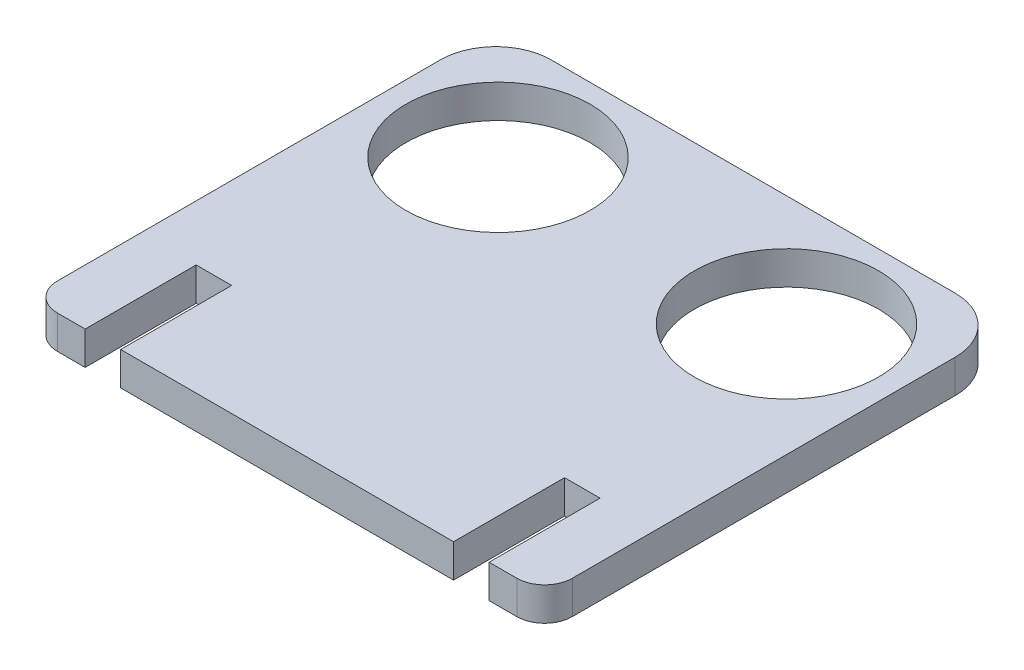
ISO-10303-21;
HEADER;
FILE_DESCRIPTION(('STEP AP214'),'2;1');
FILE_NAME('part.step','',(''),(''),'','','');
FILE_SCHEMA(('AUTOMOTIVE_DESIGN { 1 0 10303 214 1 1 1 1 }'));
ENDSEC;
DATA;
#1=APPLICATION_CONTEXT('core data for automotive mechanical design processes');
#2=APPLICATION_PROTOCOL_DEFINITION('international standard','automotive_design',2000,#1);
#3=PRODUCT_CONTEXT('',#1,'mechanical');
#4=PRODUCT('Part','Part','',(#3));
#5=PRODUCT_RELATED_PRODUCT_CATEGORY('part','',(#4));
#6=PRODUCT_DEFINITION_FORMATION('','',#4);
#7=PRODUCT_DEFINITION_CONTEXT('part definition',#1,'design');
#8=PRODUCT_DEFINITION('design','',#6,#7);
#9=PRODUCT_DEFINITION_SHAPE('','',#8);
#10=(LENGTH_UNIT() NAMED_UNIT(*) SI_UNIT(.MILLI.,.METRE.));
#11=(NAMED_UNIT(*) PLANE_ANGLE_UNIT() SI_UNIT($,.RADIAN.));
#12=(NAMED_UNIT(*) SI_UNIT($,.STERADIAN.) SOLID_ANGLE_UNIT());
#13=UNCERTAINTY_MEASURE_WITH_UNIT(LENGTH_MEASURE(1.E-05),#10,'distance_accuracy_value','');
#14=(GEOMETRIC_REPRESENTATION_CONTEXT(3) GLOBAL_UNCERTAINTY_ASSIGNED_CONTEXT((#13)) GLOBAL_UNIT_ASSIGNED_CONTEXT((#10,
#11,#12)) REPRESENTATION_CONTEXT('',''));
#15=CARTESIAN_POINT('',(0.,0.,0.));
#16=DIRECTION('',(0.,0.,1.));
#17=DIRECTION('',(1.,0.,0.));
#18=AXIS2_PLACEMENT_3D('',#15,#16,#17);
#19=CARTESIAN_POINT('',(-20.7,3.,7.5));
#20=DIRECTION('',(0.,1.,0.));
#21=DIRECTION('',(0.,0.,1.));
#22=AXIS2_PLACEMENT_3D('',#19,#20,#21);
#23=PLANE('',#22);
#24=CARTESIAN_POINT('',(13.,3.,-22.));
#25=DIRECTION('',(0.,1.,0.));
#26=DIRECTION('',(0.,0.,1.));
#27=AXIS2_PLACEMENT_3D('',#24,#25,#26);
#28=CIRCLE('',#27,8.3);
#29=CARTESIAN_POINT('',(13.,3.,-13.7));
#30=VERTEX_POINT('',#29);
#31=EDGE_CURVE('E194',#30,#30,#28,.T.);
#32=ORIENTED_EDGE('',*,*,#31,.F.);
#33=EDGE_LOOP('',(#32));
#34=FACE_BOUND('',#33,.T.);
#35=DIRECTION('',(0.,0.,-1.));
#36=VECTOR('',#35,1.);
#37=CARTESIAN_POINT('',(15.,3.,0.));
#38=LINE('',#37,#36);
#39=CARTESIAN_POINT('',(15.,3.,10.));
#40=VERTEX_POINT('',#39);
#41=CARTESIAN_POINT('',(15.,3.,0.));
#42=VERTEX_POINT('',#41);
#43=EDGE_CURVE('E238',#40,#42,#38,.T.);
#44=ORIENTED_EDGE('',*,*,#43,.T.);
#45=DIRECTION('',(1.,0.,0.));
#46=VECTOR('',#45,1.);
#47=CARTESIAN_POINT('',(18.2,3.,0.));
#48=LINE('',#47,#46);
#49=CARTESIAN_POINT('',(18.2,3.,0.));
#50=VERTEX_POINT('',#49);
#51=EDGE_CURVE('E124',#42,#50,#48,.T.);
#52=ORIENTED_EDGE('',*,*,#51,.T.);
#53=DIRECTION('',(0.,0.,1.));
#54=VECTOR('',#53,1.);
#55=CARTESIAN_POINT('',(18.2,3.,10.));
#56=LINE('',#55,#54);
#57=CARTESIAN_POINT('',(18.2,3.,10.));
#58=VERTEX_POINT('',#57);
#59=EDGE_CURVE('E291',#50,#58,#56,.T.);
#60=ORIENTED_EDGE('',*,*,#59,.T.);
#61=DIRECTION('',(1.,0.,0.));
#62=VECTOR('',#61,1.);
#63=CARTESIAN_POINT('',(20.7,3.,10.));
#64=LINE('',#63,#62);
#65=CARTESIAN_POINT('',(20.7,3.,10.));
#66=VERTEX_POINT('',#65);
#67=EDGE_CURVE('E310',#58,#66,#64,.T.);
#68=ORIENTED_EDGE('',*,*,#67,.T.);
#69=CARTESIAN_POINT('',(20.7,3.,7.5));
#70=DIRECTION('',(0.,1.,0.));
#71=DIRECTION('',(0.,0.,-1.));
#72=AXIS2_PLACEMENT_3D('',#69,#70,#71);
#73=CIRCLE('',#72,2.5);
#74=CARTESIAN_POINT('',(23.2,3.,7.5));
#75=VERTEX_POINT('',#74);
#76=EDGE_CURVE('E306',#66,#75,#73,.T.);
#77=ORIENTED_EDGE('',*,*,#76,.T.);
#78=DIRECTION('',(0.,0.,-1.));
#79=VECTOR('',#78,1.);
#80=CARTESIAN_POINT('',(23.2,3.,-12.));
#81=LINE('',#80,#79);
#82=CARTESIAN_POINT('',(23.2,3.,-27.));
#83=VERTEX_POINT('',#82);
#84=EDGE_CURVE('E309',#75,#83,#81,.T.);
#85=ORIENTED_EDGE('',*,*,#84,.T.);
#86=CARTESIAN_POINT('',(18.2,3.,-27.));
#87=DIRECTION('',(0.,1.,0.));
#88=DIRECTION('',(0.,0.,1.));
#89=AXIS2_PLACEMENT_3D('',#86,#87,#88);
#90=CIRCLE('',#89,5.);
#91=CARTESIAN_POINT('',(18.2,3.,-32.));
#92=VERTEX_POINT('',#91);
#93=EDGE_CURVE('E314',#83,#92,#90,.T.);
#94=ORIENTED_EDGE('',*,*,#93,.T.);
#95=DIRECTION('',(-1.,0.,0.));
#96=VECTOR('',#95,1.);
#97=CARTESIAN_POINT('',(18.2,3.,-32.));
#98=LINE('',#97,#96);
#99=CARTESIAN_POINT('',(-18.2,3.,-32.));
#100=VERTEX_POINT('',#99);
#101=EDGE_CURVE('E321',#92,#100,#98,.T.);
#102=ORIENTED_EDGE('',*,*,#101,.T.);
#103=CARTESIAN_POINT('',(-18.2,3.,-27.));
#104=DIRECTION('',(0.,1.,0.));
#105=DIRECTION('',(0.,0.,-1.));
#106=AXIS2_PLACEMENT_3D('',#103,#104,#105);
#107=CIRCLE('',#106,5.);
#108=CARTESIAN_POINT('',(-23.2,3.,-27.));
#109=VERTEX_POINT('',#108);
#110=EDGE_CURVE('E324',#100,#109,#107,.T.);
#111=ORIENTED_EDGE('',*,*,#110,.T.);
#112=DIRECTION('',(0.,0.,1.));
#113=VECTOR('',#112,1.);
#114=CARTESIAN_POINT('',(-23.2,3.,-27.));
#115=LINE('',#114,#113);
#116=CARTESIAN_POINT('',(-23.2,3.,7.5));
#117=VERTEX_POINT('',#116);
#118=EDGE_CURVE('E327',#109,#117,#115,.T.);
#119=ORIENTED_EDGE('',*,*,#118,.T.);
#120=CARTESIAN_POINT('',(-20.7,3.,7.5));
#121=DIRECTION('',(0.,1.,0.));
#122=DIRECTION('',(0.,0.,1.));
#123=AXIS2_PLACEMENT_3D('',#120,#121,#122);
#124=CIRCLE('',#123,2.5);
#125=CARTESIAN_POINT('',(-20.7,3.,10.));
#126=VERTEX_POINT('',#125);
#127=EDGE_CURVE('E330',#117,#126,#124,.T.);
#128=ORIENTED_EDGE('',*,*,#127,.T.);
#129=DIRECTION('',(1.,0.,0.));
#130=VECTOR('',#129,1.);
#131=CARTESIAN_POINT('',(-20.7,3.,10.));
#132=LINE('',#131,#130);
#133=CARTESIAN_POINT('',(-18.2,3.,10.));
#134=VERTEX_POINT('',#133);
#135=EDGE_CURVE('E333',#126,#134,#132,.T.);
#136=ORIENTED_EDGE('',*,*,#135,.T.);
#137=DIRECTION('',(0.,0.,-1.));
#138=VECTOR('',#137,1.);
#139=CARTESIAN_POINT('',(-18.2,3.,10.));
#140=LINE('',#139,#138);
#141=CARTESIAN_POINT('',(-18.2,3.,0.));
#142=VERTEX_POINT('',#141);
#143=EDGE_CURVE('E167',#134,#142,#140,.T.);
#144=ORIENTED_EDGE('',*,*,#143,.T.);
#145=DIRECTION('',(1.,0.,0.));
#146=VECTOR('',#145,1.);
#147=CARTESIAN_POINT('',(-18.2,3.,0.));
#148=LINE('',#147,#146);
#149=CARTESIAN_POINT('',(-15.,3.,0.));
#150=VERTEX_POINT('',#149);
#151=EDGE_CURVE('E161',#142,#150,#148,.T.);
#152=ORIENTED_EDGE('',*,*,#151,.T.);
#153=DIRECTION('',(0.,0.,1.));
#154=VECTOR('',#153,1.);
#155=CARTESIAN_POINT('',(-15.,3.,0.));
#156=LINE('',#155,#154);
#157=CARTESIAN_POINT('',(-15.,3.,10.));
#158=VERTEX_POINT('',#157);
#159=EDGE_CURVE('E165',#150,#158,#156,.T.);
#160=ORIENTED_EDGE('',*,*,#159,.T.);
#161=DIRECTION('',(1.,0.,0.));
#162=VECTOR('',#161,1.);
#163=CARTESIAN_POINT('',(-15.,3.,10.));
#164=LINE('',#163,#162);
#165=EDGE_CURVE('E57',#158,#40,#164,.T.);
#166=ORIENTED_EDGE('',*,*,#165,.T.);
#167=EDGE_LOOP('',(#44,#52,#60,#68,#77,#85,#94,#102,#111,#119,#128,#136,#144,#152,#160,#166));
#168=FACE_BOUND('',#167,.T.);
#169=CARTESIAN_POINT('',(-13.,3.,-22.));
#170=DIRECTION('',(0.,1.,0.));
#171=DIRECTION('',(0.,0.,-1.));
#172=AXIS2_PLACEMENT_3D('',#169,#170,#171);
#173=CIRCLE('',#172,8.3);
#174=CARTESIAN_POINT('',(-13.,3.,-30.3));
#175=VERTEX_POINT('',#174);
#176=EDGE_CURVE('E377',#175,#175,#173,.T.);
#177=ORIENTED_EDGE('',*,*,#176,.F.);
#178=EDGE_LOOP('',(#177));
#179=FACE_BOUND('',#178,.T.);
#180=ADVANCED_FACE('F39',(#34,#168,#179),#23,.T.);
#181=CARTESIAN_POINT('',(-20.7,0.,7.5));
#182=DIRECTION('',(0.,1.,0.));
#183=DIRECTION('',(0.,0.,1.));
#184=AXIS2_PLACEMENT_3D('',#181,#182,#183);
#185=PLANE('',#184);
#186=DIRECTION('',(0.,0.,-1.));
#187=VECTOR('',#186,1.);
#188=CARTESIAN_POINT('',(15.,0.,0.));
#189=LINE('',#188,#187);
#190=CARTESIAN_POINT('',(15.,0.,10.));
#191=VERTEX_POINT('',#190);
#192=CARTESIAN_POINT('',(15.,0.,0.));
#193=VERTEX_POINT('',#192);
#194=EDGE_CURVE('E189',#191,#193,#189,.T.);
#195=ORIENTED_EDGE('',*,*,#194,.F.);
#196=DIRECTION('',(1.,0.,0.));
#197=VECTOR('',#196,1.);
#198=CARTESIAN_POINT('',(-15.,0.,10.));
#199=LINE('',#198,#197);
#200=CARTESIAN_POINT('',(-15.,0.,10.));
#201=VERTEX_POINT('',#200);
#202=EDGE_CURVE('E116',#201,#191,#199,.T.);
#203=ORIENTED_EDGE('',*,*,#202,.F.);
#204=DIRECTION('',(0.,0.,1.));
#205=VECTOR('',#204,1.);
#206=CARTESIAN_POINT('',(-15.,0.,0.));
#207=LINE('',#206,#205);
#208=CARTESIAN_POINT('',(-15.,0.,0.));
#209=VERTEX_POINT('',#208);
#210=EDGE_CURVE('E110',#209,#201,#207,.T.);
#211=ORIENTED_EDGE('',*,*,#210,.F.);
#212=DIRECTION('',(1.,0.,0.));
#213=VECTOR('',#212,1.);
#214=CARTESIAN_POINT('',(-18.2,0.,0.));
#215=LINE('',#214,#213);
#216=CARTESIAN_POINT('',(-18.2,0.,0.));
#217=VERTEX_POINT('',#216);
#218=EDGE_CURVE('E176',#217,#209,#215,.T.);
#219=ORIENTED_EDGE('',*,*,#218,.F.);
#220=DIRECTION('',(0.,0.,-1.));
#221=VECTOR('',#220,1.);
#222=CARTESIAN_POINT('',(-18.2,0.,10.));
#223=LINE('',#222,#221);
#224=CARTESIAN_POINT('',(-18.2,0.,10.));
#225=VERTEX_POINT('',#224);
#226=EDGE_CURVE('E229',#225,#217,#223,.T.);
#227=ORIENTED_EDGE('',*,*,#226,.F.);
#228=DIRECTION('',(1.,0.,0.));
#229=VECTOR('',#228,1.);
#230=CARTESIAN_POINT('',(-20.7,0.,10.));
#231=LINE('',#230,#229);
#232=CARTESIAN_POINT('',(-20.7,0.,10.));
#233=VERTEX_POINT('',#232);
#234=EDGE_CURVE('E226',#233,#225,#231,.T.);
#235=ORIENTED_EDGE('',*,*,#234,.F.);
#236=CARTESIAN_POINT('',(-20.7,0.,7.5));
#237=DIRECTION('',(0.,1.,0.));
#238=DIRECTION('',(0.,0.,1.));
#239=AXIS2_PLACEMENT_3D('',#236,#237,#238);
#240=CIRCLE('',#239,2.5);
#241=CARTESIAN_POINT('',(-23.2,0.,7.5));
#242=VERTEX_POINT('',#241);
#243=EDGE_CURVE('E223',#242,#233,#240,.T.);
#244=ORIENTED_EDGE('',*,*,#243,.F.);
#245=DIRECTION('',(0.,0.,1.));
#246=VECTOR('',#245,1.);
#247=CARTESIAN_POINT('',(-23.2,0.,-12.));
#248=LINE('',#247,#246);
#249=CARTESIAN_POINT('',(-23.2,0.,-27.));
#250=VERTEX_POINT('',#249);
#251=EDGE_CURVE('E220',#250,#242,#248,.T.);
#252=ORIENTED_EDGE('',*,*,#251,.F.);
#253=CARTESIAN_POINT('',(-18.2,0.,-27.));
#254=DIRECTION('',(0.,1.,0.));
#255=DIRECTION('',(0.,0.,-1.));
#256=AXIS2_PLACEMENT_3D('',#253,#254,#255);
#257=CIRCLE('',#256,5.);
#258=CARTESIAN_POINT('',(-18.2,0.,-32.));
#259=VERTEX_POINT('',#258);
#260=EDGE_CURVE('E216',#259,#250,#257,.T.);
#261=ORIENTED_EDGE('',*,*,#260,.F.);
#262=DIRECTION('',(-1.,0.,0.));
#263=VECTOR('',#262,1.);
#264=CARTESIAN_POINT('',(18.2,0.,-32.));
#265=LINE('',#264,#263);
#266=CARTESIAN_POINT('',(18.2,0.,-32.));
#267=VERTEX_POINT('',#266);
#268=EDGE_CURVE('E213',#267,#259,#265,.T.);
#269=ORIENTED_EDGE('',*,*,#268,.F.);
#270=CARTESIAN_POINT('',(18.2,0.,-27.));
#271=DIRECTION('',(0.,1.,0.));
#272=DIRECTION('',(0.,0.,1.));
#273=AXIS2_PLACEMENT_3D('',#270,#271,#272);
#274=CIRCLE('',#273,5.);
#275=CARTESIAN_POINT('',(23.2,0.,-27.));
#276=VERTEX_POINT('',#275);
#277=EDGE_CURVE('E210',#276,#267,#274,.T.);
#278=ORIENTED_EDGE('',*,*,#277,.F.);
#279=DIRECTION('',(0.,0.,-1.));
#280=VECTOR('',#279,1.);
#281=CARTESIAN_POINT('',(23.2,0.,-12.));
#282=LINE('',#281,#280);
#283=CARTESIAN_POINT('',(23.2,0.,7.5));
#284=VERTEX_POINT('',#283);
#285=EDGE_CURVE('E207',#284,#276,#282,.T.);
#286=ORIENTED_EDGE('',*,*,#285,.F.);
#287=CARTESIAN_POINT('',(20.7,0.,7.5));
#288=DIRECTION('',(0.,1.,0.));
#289=DIRECTION('',(0.,0.,-1.));
#290=AXIS2_PLACEMENT_3D('',#287,#288,#289);
#291=CIRCLE('',#290,2.5);
#292=CARTESIAN_POINT('',(20.7,0.,10.));
#293=VERTEX_POINT('',#292);
#294=EDGE_CURVE('E203',#293,#284,#291,.T.);
#295=ORIENTED_EDGE('',*,*,#294,.F.);
#296=DIRECTION('',(1.,0.,0.));
#297=VECTOR('',#296,1.);
#298=CARTESIAN_POINT('',(20.7,0.,10.));
#299=LINE('',#298,#297);
#300=CARTESIAN_POINT('',(18.2,0.,10.));
#301=VERTEX_POINT('',#300);
#302=EDGE_CURVE('E200',#301,#293,#299,.T.);
#303=ORIENTED_EDGE('',*,*,#302,.F.);
#304=DIRECTION('',(0.,0.,1.));
#305=VECTOR('',#304,1.);
#306=CARTESIAN_POINT('',(18.2,0.,10.));
#307=LINE('',#306,#305);
#308=CARTESIAN_POINT('',(18.2,0.,0.));
#309=VERTEX_POINT('',#308);
#310=EDGE_CURVE('E197',#309,#301,#307,.T.);
#311=ORIENTED_EDGE('',*,*,#310,.F.);
#312=DIRECTION('',(1.,0.,0.));
#313=VECTOR('',#312,1.);
#314=CARTESIAN_POINT('',(18.2,0.,0.));
#315=LINE('',#314,#313);
#316=EDGE_CURVE('E193',#193,#309,#315,.T.);
#317=ORIENTED_EDGE('',*,*,#316,.F.);
#318=EDGE_LOOP('',(#195,#203,#211,#219,#227,#235,#244,#252,#261,#269,#278,#286,#295,#303,#311,#317));
#319=FACE_BOUND('',#318,.T.);
#320=CARTESIAN_POINT('',(13.,0.,-22.));
#321=DIRECTION('',(0.,1.,0.));
#322=DIRECTION('',(0.,0.,1.));
#323=AXIS2_PLACEMENT_3D('',#320,#321,#322);
#324=CIRCLE('',#323,8.3);
#325=CARTESIAN_POINT('',(13.,0.,-13.7));
#326=VERTEX_POINT('',#325);
#327=EDGE_CURVE('E385',#326,#326,#324,.T.);
#328=ORIENTED_EDGE('',*,*,#327,.T.);
#329=EDGE_LOOP('',(#328));
#330=FACE_BOUND('',#329,.T.);
#331=CARTESIAN_POINT('',(-13.,0.,-22.));
#332=DIRECTION('',(0.,1.,0.));
#333=DIRECTION('',(0.,0.,-1.));
#334=AXIS2_PLACEMENT_3D('',#331,#332,#333);
#335=CIRCLE('',#334,8.3);
#336=CARTESIAN_POINT('',(-13.,0.,-30.3));
#337=VERTEX_POINT('',#336);
#338=EDGE_CURVE('E380',#337,#337,#335,.T.);
#339=ORIENTED_EDGE('',*,*,#338,.T.);
#340=EDGE_LOOP('',(#339));
#341=FACE_BOUND('',#340,.T.);
#342=ADVANCED_FACE('F295',(#319,#330,#341),#185,.F.);
#343=CARTESIAN_POINT('',(15.,3.,0.));
#344=DIRECTION('',(-1.,0.,0.));
#345=DIRECTION('',(0.,0.,1.));
#346=AXIS2_PLACEMENT_3D('',#343,#344,#345);
#347=PLANE('',#346);
#348=ORIENTED_EDGE('',*,*,#194,.T.);
#349=DIRECTION('',(0.,-1.,0.));
#350=VECTOR('',#349,1.);
#351=CARTESIAN_POINT('',(15.,3.,0.));
#352=LINE('',#351,#350);
#353=EDGE_CURVE('E11',#42,#193,#352,.T.);
#354=ORIENTED_EDGE('',*,*,#353,.F.);
#355=ORIENTED_EDGE('',*,*,#43,.F.);
#356=DIRECTION('',(0.,-1.,0.));
#357=VECTOR('',#356,1.);
#358=CARTESIAN_POINT('',(15.,3.,10.));
#359=LINE('',#358,#357);
#360=EDGE_CURVE('E185',#40,#191,#359,.T.);
#361=ORIENTED_EDGE('',*,*,#360,.T.);
#362=EDGE_LOOP('',(#348,#354,#355,#361));
#363=FACE_BOUND('',#362,.T.);
#364=ADVANCED_FACE('F41',(#363),#347,.F.);
#365=CARTESIAN_POINT('',(18.2,3.,0.));
#366=DIRECTION('',(0.,0.,-1.));
#367=DIRECTION('',(-1.,0.,0.));
#368=AXIS2_PLACEMENT_3D('',#365,#366,#367);
#369=PLANE('',#368);
#370=ORIENTED_EDGE('',*,*,#316,.T.);
#371=DIRECTION('',(0.,-1.,0.));
#372=VECTOR('',#371,1.);
#373=CARTESIAN_POINT('',(18.2,3.,0.));
#374=LINE('',#373,#372);
#375=EDGE_CURVE('E49',#50,#309,#374,.T.);
#376=ORIENTED_EDGE('',*,*,#375,.F.);
#377=ORIENTED_EDGE('',*,*,#51,.F.);
#378=ORIENTED_EDGE('',*,*,#353,.T.);
#379=EDGE_LOOP('',(#370,#376,#377,#378));
#380=FACE_BOUND('',#379,.T.);
#381=ADVANCED_FACE('F525',(#380),#369,.F.);
#382=CARTESIAN_POINT('',(18.2,3.,10.));
#383=DIRECTION('',(1.,0.,0.));
#384=DIRECTION('',(0.,0.,-1.));
#385=AXIS2_PLACEMENT_3D('',#382,#383,#384);
#386=PLANE('',#385);
#387=ORIENTED_EDGE('',*,*,#310,.T.);
#388=DIRECTION('',(0.,-1.,0.));
#389=VECTOR('',#388,1.);
#390=CARTESIAN_POINT('',(18.2,3.,10.));
#391=LINE('',#390,#389);
#392=EDGE_CURVE('E281',#58,#301,#391,.T.);
#393=ORIENTED_EDGE('',*,*,#392,.F.);
#394=ORIENTED_EDGE('',*,*,#59,.F.);
#395=ORIENTED_EDGE('',*,*,#375,.T.);
#396=EDGE_LOOP('',(#387,#393,#394,#395));
#397=FACE_BOUND('',#396,.T.);
#398=ADVANCED_FACE('F289',(#397),#386,.F.);
#399=CARTESIAN_POINT('',(20.7,3.,10.));
#400=DIRECTION('',(0.,0.,-1.));
#401=DIRECTION('',(-1.,0.,0.));
#402=AXIS2_PLACEMENT_3D('',#399,#400,#401);
#403=PLANE('',#402);
#404=ORIENTED_EDGE('',*,*,#302,.T.);
#405=DIRECTION('',(0.,-1.,0.));
#406=VECTOR('',#405,1.);
#407=CARTESIAN_POINT('',(20.7,3.,10.));
#408=LINE('',#407,#406);
#409=EDGE_CURVE('E277',#66,#293,#408,.T.);
#410=ORIENTED_EDGE('',*,*,#409,.F.);
#411=ORIENTED_EDGE('',*,*,#67,.F.);
#412=ORIENTED_EDGE('',*,*,#392,.T.);
#413=EDGE_LOOP('',(#404,#410,#411,#412));
#414=FACE_BOUND('',#413,.T.);
#415=ADVANCED_FACE('F300',(#414),#403,.F.);
#416=CARTESIAN_POINT('',(20.7,3.,7.5));
#417=DIRECTION('',(0.,-1.,0.));
#418=DIRECTION('',(0.,0.,-1.));
#419=AXIS2_PLACEMENT_3D('',#416,#417,#418);
#420=CYLINDRICAL_SURFACE('',#419,2.5);
#421=ORIENTED_EDGE('',*,*,#294,.T.);
#422=DIRECTION('',(0.,-1.,0.));
#423=VECTOR('',#422,1.);
#424=CARTESIAN_POINT('',(23.2,3.,7.5));
#425=LINE('',#424,#423);
#426=EDGE_CURVE('E273',#75,#284,#425,.T.);
#427=ORIENTED_EDGE('',*,*,#426,.F.);
#428=ORIENTED_EDGE('',*,*,#76,.F.);
#429=ORIENTED_EDGE('',*,*,#409,.T.);
#430=EDGE_LOOP('',(#421,#427,#428,#429));
#431=FACE_BOUND('',#430,.T.);
#432=ADVANCED_FACE('F304',(#431),#420,.T.);
#433=CARTESIAN_POINT('',(23.2,3.,-12.));
#434=DIRECTION('',(-1.,0.,0.));
#435=DIRECTION('',(0.,0.,1.));
#436=AXIS2_PLACEMENT_3D('',#433,#434,#435);
#437=PLANE('',#436);
#438=ORIENTED_EDGE('',*,*,#285,.T.);
#439=DIRECTION('',(0.,-1.,0.));
#440=VECTOR('',#439,1.);
#441=CARTESIAN_POINT('',(23.2,3.,-27.));
#442=LINE('',#441,#440);
#443=EDGE_CURVE('E269',#83,#276,#442,.T.);
#444=ORIENTED_EDGE('',*,*,#443,.F.);
#445=ORIENTED_EDGE('',*,*,#84,.F.);
#446=ORIENTED_EDGE('',*,*,#426,.T.);
#447=EDGE_LOOP('',(#438,#444,#445,#446));
#448=FACE_BOUND('',#447,.T.);
#449=ADVANCED_FACE('F489',(#448),#437,.F.);
#450=CARTESIAN_POINT('',(18.2,3.,-27.));
#451=DIRECTION('',(0.,-1.,0.));
#452=DIRECTION('',(0.,0.,-1.));
#453=AXIS2_PLACEMENT_3D('',#450,#451,#452);
#454=CYLINDRICAL_SURFACE('',#453,5.);
#455=ORIENTED_EDGE('',*,*,#277,.T.);
#456=DIRECTION('',(0.,-1.,0.));
#457=VECTOR('',#456,1.);
#458=CARTESIAN_POINT('',(18.2,3.,-32.));
#459=LINE('',#458,#457);
#460=EDGE_CURVE('E265',#92,#267,#459,.T.);
#461=ORIENTED_EDGE('',*,*,#460,.F.);
#462=ORIENTED_EDGE('',*,*,#93,.F.);
#463=ORIENTED_EDGE('',*,*,#443,.T.);
#464=EDGE_LOOP('',(#455,#461,#462,#463));
#465=FACE_BOUND('',#464,.T.);
#466=ADVANCED_FACE('F479',(#465),#454,.T.);
#467=CARTESIAN_POINT('',(18.2,3.,-32.));
#468=DIRECTION('',(0.,0.,1.));
#469=DIRECTION('',(1.,0.,0.));
#470=AXIS2_PLACEMENT_3D('',#467,#468,#469);
#471=PLANE('',#470);
#472=ORIENTED_EDGE('',*,*,#268,.T.);
#473=DIRECTION('',(0.,-1.,0.));
#474=VECTOR('',#473,1.);
#475=CARTESIAN_POINT('',(-18.2,3.,-32.));
#476=LINE('',#475,#474);
#477=EDGE_CURVE('E261',#100,#259,#476,.T.);
#478=ORIENTED_EDGE('',*,*,#477,.F.);
#479=ORIENTED_EDGE('',*,*,#101,.F.);
#480=ORIENTED_EDGE('',*,*,#460,.T.);
#481=EDGE_LOOP('',(#472,#478,#479,#480));
#482=FACE_BOUND('',#481,.T.);
#483=ADVANCED_FACE('F469',(#482),#471,.F.);
#484=CARTESIAN_POINT('',(-18.2,3.,-27.));
#485=DIRECTION('',(0.,-1.,0.));
#486=DIRECTION('',(0.,0.,-1.));
#487=AXIS2_PLACEMENT_3D('',#484,#485,#486);
#488=CYLINDRICAL_SURFACE('',#487,5.);
#489=ORIENTED_EDGE('',*,*,#260,.T.);
#490=DIRECTION('',(0.,-1.,0.));
#491=VECTOR('',#490,1.);
#492=CARTESIAN_POINT('',(-23.2,3.,-27.));
#493=LINE('',#492,#491);
#494=EDGE_CURVE('E257',#109,#250,#493,.T.);
#495=ORIENTED_EDGE('',*,*,#494,.F.);
#496=ORIENTED_EDGE('',*,*,#110,.F.);
#497=ORIENTED_EDGE('',*,*,#477,.T.);
#498=EDGE_LOOP('',(#489,#495,#496,#497));
#499=FACE_BOUND('',#498,.T.);
#500=ADVANCED_FACE('F458',(#499),#488,.T.);
#501=CARTESIAN_POINT('',(-23.2,3.,-12.));
#502=DIRECTION('',(1.,0.,0.));
#503=DIRECTION('',(0.,0.,-1.));
#504=AXIS2_PLACEMENT_3D('',#501,#502,#503);
#505=PLANE('',#504);
#506=ORIENTED_EDGE('',*,*,#251,.T.);
#507=DIRECTION('',(0.,-1.,0.));
#508=VECTOR('',#507,1.);
#509=CARTESIAN_POINT('',(-23.2,3.,7.5));
#510=LINE('',#509,#508);
#511=EDGE_CURVE('E253',#117,#242,#510,.T.);
#512=ORIENTED_EDGE('',*,*,#511,.F.);
#513=ORIENTED_EDGE('',*,*,#118,.F.);
#514=ORIENTED_EDGE('',*,*,#494,.T.);
#515=EDGE_LOOP('',(#506,#512,#513,#514));
#516=FACE_BOUND('',#515,.T.);
#517=ADVANCED_FACE('F448',(#516),#505,.F.);
#518=CARTESIAN_POINT('',(-20.7,3.,7.5));
#519=DIRECTION('',(0.,-1.,0.));
#520=DIRECTION('',(0.,0.,-1.));
#521=AXIS2_PLACEMENT_3D('',#518,#519,#520);
#522=CYLINDRICAL_SURFACE('',#521,2.5);
#523=ORIENTED_EDGE('',*,*,#243,.T.);
#524=DIRECTION('',(0.,-1.,0.));
#525=VECTOR('',#524,1.);
#526=CARTESIAN_POINT('',(-20.7,3.,10.));
#527=LINE('',#526,#525);
#528=EDGE_CURVE('E249',#126,#233,#527,.T.);
#529=ORIENTED_EDGE('',*,*,#528,.F.);
#530=ORIENTED_EDGE('',*,*,#127,.F.);
#531=ORIENTED_EDGE('',*,*,#511,.T.);
#532=EDGE_LOOP('',(#523,#529,#530,#531));
#533=FACE_BOUND('',#532,.T.);
#534=ADVANCED_FACE('F439',(#533),#522,.T.);
#535=CARTESIAN_POINT('',(-20.7,3.,10.));
#536=DIRECTION('',(0.,0.,-1.));
#537=DIRECTION('',(-1.,0.,0.));
#538=AXIS2_PLACEMENT_3D('',#535,#536,#537);
#539=PLANE('',#538);
#540=ORIENTED_EDGE('',*,*,#234,.T.);
#541=DIRECTION('',(0.,-1.,0.));
#542=VECTOR('',#541,1.);
#543=CARTESIAN_POINT('',(-18.2,3.,10.));
#544=LINE('',#543,#542);
#545=EDGE_CURVE('E245',#134,#225,#544,.T.);
#546=ORIENTED_EDGE('',*,*,#545,.F.);
#547=ORIENTED_EDGE('',*,*,#135,.F.);
#548=ORIENTED_EDGE('',*,*,#528,.T.);
#549=EDGE_LOOP('',(#540,#546,#547,#548));
#550=FACE_BOUND('',#549,.T.);
#551=ADVANCED_FACE('F341',(#550),#539,.F.);
#552=CARTESIAN_POINT('',(-18.2,3.,10.));
#553=DIRECTION('',(-1.,0.,0.));
#554=DIRECTION('',(0.,0.,1.));
#555=AXIS2_PLACEMENT_3D('',#552,#553,#554);
#556=PLANE('',#555);
#557=ORIENTED_EDGE('',*,*,#226,.T.);
#558=DIRECTION('',(0.,-1.,0.));
#559=VECTOR('',#558,1.);
#560=CARTESIAN_POINT('',(-18.2,3.,0.));
#561=LINE('',#560,#559);
#562=EDGE_CURVE('E178',#142,#217,#561,.T.);
#563=ORIENTED_EDGE('',*,*,#562,.F.);
#564=ORIENTED_EDGE('',*,*,#143,.F.);
#565=ORIENTED_EDGE('',*,*,#545,.T.);
#566=EDGE_LOOP('',(#557,#563,#564,#565));
#567=FACE_BOUND('',#566,.T.);
#568=ADVANCED_FACE('F345',(#567),#556,.F.);
#569=CARTESIAN_POINT('',(-18.2,3.,0.));
#570=DIRECTION('',(0.,0.,-1.));
#571=DIRECTION('',(-1.,0.,0.));
#572=AXIS2_PLACEMENT_3D('',#569,#570,#571);
#573=PLANE('',#572);
#574=ORIENTED_EDGE('',*,*,#218,.T.);
#575=DIRECTION('',(0.,-1.,0.));
#576=VECTOR('',#575,1.);
#577=CARTESIAN_POINT('',(-15.,3.,0.));
#578=LINE('',#577,#576);
#579=EDGE_CURVE('E173',#150,#209,#578,.T.);
#580=ORIENTED_EDGE('',*,*,#579,.F.);
#581=ORIENTED_EDGE('',*,*,#151,.F.);
#582=ORIENTED_EDGE('',*,*,#562,.T.);
#583=EDGE_LOOP('',(#574,#580,#581,#582));
#584=FACE_BOUND('',#583,.T.);
#585=ADVANCED_FACE('F174',(#584),#573,.F.);
#586=CARTESIAN_POINT('',(-15.,3.,0.));
#587=DIRECTION('',(1.,0.,0.));
#588=DIRECTION('',(0.,0.,-1.));
#589=AXIS2_PLACEMENT_3D('',#586,#587,#588);
#590=PLANE('',#589);
#591=ORIENTED_EDGE('',*,*,#210,.T.);
#592=DIRECTION('',(0.,-1.,0.));
#593=VECTOR('',#592,1.);
#594=CARTESIAN_POINT('',(-15.,3.,10.));
#595=LINE('',#594,#593);
#596=EDGE_CURVE('E179',#158,#201,#595,.T.);
#597=ORIENTED_EDGE('',*,*,#596,.F.);
#598=ORIENTED_EDGE('',*,*,#159,.F.);
#599=ORIENTED_EDGE('',*,*,#579,.T.);
#600=EDGE_LOOP('',(#591,#597,#598,#599));
#601=FACE_BOUND('',#600,.T.);
#602=ADVANCED_FACE('F181',(#601),#590,.F.);
#603=CARTESIAN_POINT('',(-15.,3.,10.));
#604=DIRECTION('',(0.,0.,-1.));
#605=DIRECTION('',(-1.,0.,0.));
#606=AXIS2_PLACEMENT_3D('',#603,#604,#605);
#607=PLANE('',#606);
#608=ORIENTED_EDGE('',*,*,#202,.T.);
#609=ORIENTED_EDGE('',*,*,#360,.F.);
#610=ORIENTED_EDGE('',*,*,#165,.F.);
#611=ORIENTED_EDGE('',*,*,#596,.T.);
#612=EDGE_LOOP('',(#608,#609,#610,#611));
#613=FACE_BOUND('',#612,.T.);
#614=ADVANCED_FACE('F349',(#613),#607,.F.);
#615=CARTESIAN_POINT('',(13.,3.,-22.));
#616=DIRECTION('',(0.,-1.,0.));
#617=DIRECTION('',(0.,0.,-1.));
#618=AXIS2_PLACEMENT_3D('',#615,#616,#617);
#619=CYLINDRICAL_SURFACE('',#618,8.3);
#620=ORIENTED_EDGE('',*,*,#31,.T.);
#621=EDGE_LOOP('',(#620));
#622=FACE_BOUND('',#621,.T.);
#623=ORIENTED_EDGE('',*,*,#327,.F.);
#624=EDGE_LOOP('',(#623));
#625=FACE_BOUND('',#624,.T.);
#626=ADVANCED_FACE('F351',(#622,#625),#619,.F.);
#627=CARTESIAN_POINT('',(-13.,3.,-22.));
#628=DIRECTION('',(0.,-1.,0.));
#629=DIRECTION('',(0.,0.,-1.));
#630=AXIS2_PLACEMENT_3D('',#627,#628,#629);
#631=CYLINDRICAL_SURFACE('',#630,8.3);
#632=ORIENTED_EDGE('',*,*,#176,.T.);
#633=EDGE_LOOP('',(#632));
#634=FACE_BOUND('',#633,.T.);
#635=ORIENTED_EDGE('',*,*,#338,.F.);
#636=EDGE_LOOP('',(#635));
#637=FACE_BOUND('',#636,.T.);
#638=ADVANCED_FACE('F357',(#634,#637),#631,.F.);
#639=CLOSED_SHELL('',(#180,#342,#364,#381,#398,#415,#432,#449,#466,#483,#500,#517,#534,#551,
#568,#585,#602,#614,#626,#638));
#640=MANIFOLD_SOLID_BREP('B2',#639);
#641=ADVANCED_BREP_SHAPE_REPRESENTATION('',(#18,#640),#14);
#642=SHAPE_DEFINITION_REPRESENTATION(#9,#641);
ENDSEC;
END-ISO-10303-21;
